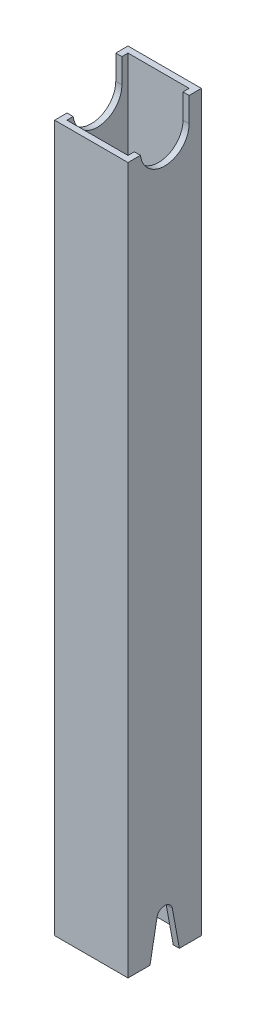
ISO-10303-21;
HEADER;
FILE_DESCRIPTION(('STEP AP214'),'2;1');
FILE_NAME('part.step','',(''),(''),'','','');
FILE_SCHEMA(('AUTOMOTIVE_DESIGN { 1 0 10303 214 1 1 1 1 }'));
ENDSEC;
DATA;
#1=APPLICATION_CONTEXT('core data for automotive mechanical design processes');
#2=APPLICATION_PROTOCOL_DEFINITION('international standard','automotive_design',2000,#1);
#3=PRODUCT_CONTEXT('',#1,'mechanical');
#4=PRODUCT('Part','Part','',(#3));
#5=PRODUCT_RELATED_PRODUCT_CATEGORY('part','',(#4));
#6=PRODUCT_DEFINITION_FORMATION('','',#4);
#7=PRODUCT_DEFINITION_CONTEXT('part definition',#1,'design');
#8=PRODUCT_DEFINITION('design','',#6,#7);
#9=PRODUCT_DEFINITION_SHAPE('','',#8);
#10=(LENGTH_UNIT() NAMED_UNIT(*) SI_UNIT(.MILLI.,.METRE.));
#11=(NAMED_UNIT(*) PLANE_ANGLE_UNIT() SI_UNIT($,.RADIAN.));
#12=(NAMED_UNIT(*) SI_UNIT($,.STERADIAN.) SOLID_ANGLE_UNIT());
#13=UNCERTAINTY_MEASURE_WITH_UNIT(LENGTH_MEASURE(1.E-05),#10,'distance_accuracy_value','');
#14=(GEOMETRIC_REPRESENTATION_CONTEXT(3) GLOBAL_UNCERTAINTY_ASSIGNED_CONTEXT((#13)) GLOBAL_UNIT_ASSIGNED_CONTEXT((#10,
#11,#12)) REPRESENTATION_CONTEXT('',''));
#15=CARTESIAN_POINT('',(0.,0.,0.));
#16=DIRECTION('',(0.,0.,1.));
#17=DIRECTION('',(1.,0.,0.));
#18=AXIS2_PLACEMENT_3D('',#15,#16,#17);
#19=CARTESIAN_POINT('',(0.,0.,0.));
#20=DIRECTION('',(0.,1.,0.));
#21=DIRECTION('',(0.,0.,1.));
#22=AXIS2_PLACEMENT_3D('',#19,#20,#21);
#23=PLANE('',#22);
#24=DIRECTION('',(0.,0.,1.));
#25=VECTOR('',#24,1.);
#26=CARTESIAN_POINT('',(-15.,0.,-15.));
#27=LINE('',#26,#25);
#28=CARTESIAN_POINT('',(-15.,0.,6.));
#29=VERTEX_POINT('',#28);
#30=CARTESIAN_POINT('',(-15.,0.,15.));
#31=VERTEX_POINT('',#30);
#32=EDGE_CURVE('E229',#29,#31,#27,.T.);
#33=ORIENTED_EDGE('',*,*,#32,.F.);
#34=DIRECTION('',(-1.,0.,0.));
#35=VECTOR('',#34,1.);
#36=CARTESIAN_POINT('',(15.,0.,6.));
#37=LINE('',#36,#35);
#38=CARTESIAN_POINT('',(-12.5,0.,6.));
#39=VERTEX_POINT('',#38);
#40=EDGE_CURVE('E199',#39,#29,#37,.T.);
#41=ORIENTED_EDGE('',*,*,#40,.F.);
#42=DIRECTION('',(0.,0.,1.));
#43=VECTOR('',#42,1.);
#44=CARTESIAN_POINT('',(-12.5,0.,-12.5));
#45=LINE('',#44,#43);
#46=CARTESIAN_POINT('',(-12.5,0.,12.5));
#47=VERTEX_POINT('',#46);
#48=EDGE_CURVE('E300',#39,#47,#45,.T.);
#49=ORIENTED_EDGE('',*,*,#48,.T.);
#50=DIRECTION('',(1.,0.,0.));
#51=VECTOR('',#50,1.);
#52=CARTESIAN_POINT('',(-12.5,0.,12.5));
#53=LINE('',#52,#51);
#54=CARTESIAN_POINT('',(12.5,0.,12.5));
#55=VERTEX_POINT('',#54);
#56=EDGE_CURVE('E304',#47,#55,#53,.T.);
#57=ORIENTED_EDGE('',*,*,#56,.T.);
#58=DIRECTION('',(0.,0.,-1.));
#59=VECTOR('',#58,1.);
#60=CARTESIAN_POINT('',(12.5,0.,-12.5));
#61=LINE('',#60,#59);
#62=CARTESIAN_POINT('',(12.5,0.,6.));
#63=VERTEX_POINT('',#62);
#64=EDGE_CURVE('E293',#55,#63,#61,.T.);
#65=ORIENTED_EDGE('',*,*,#64,.T.);
#66=CARTESIAN_POINT('',(15.,0.,6.));
#67=VERTEX_POINT('',#66);
#68=EDGE_CURVE('E384',#67,#63,#37,.T.);
#69=ORIENTED_EDGE('',*,*,#68,.F.);
#70=DIRECTION('',(0.,0.,-1.));
#71=VECTOR('',#70,1.);
#72=CARTESIAN_POINT('',(15.,0.,-15.));
#73=LINE('',#72,#71);
#74=CARTESIAN_POINT('',(15.,0.,15.));
#75=VERTEX_POINT('',#74);
#76=EDGE_CURVE('E217',#75,#67,#73,.T.);
#77=ORIENTED_EDGE('',*,*,#76,.F.);
#78=DIRECTION('',(1.,0.,0.));
#79=VECTOR('',#78,1.);
#80=CARTESIAN_POINT('',(-15.,0.,15.));
#81=LINE('',#80,#79);
#82=EDGE_CURVE('E233',#31,#75,#81,.T.);
#83=ORIENTED_EDGE('',*,*,#82,.F.);
#84=EDGE_LOOP('',(#33,#41,#49,#57,#65,#69,#77,#83));
#85=FACE_BOUND('',#84,.T.);
#86=ADVANCED_FACE('F39',(#85),#23,.F.);
#87=CARTESIAN_POINT('',(-15.,15.,0.));
#88=DIRECTION('',(-1.,0.,0.));
#89=DIRECTION('',(0.,0.,1.));
#90=AXIS2_PLACEMENT_3D('',#87,#88,#89);
#91=CYLINDRICAL_SURFACE('',#90,3.17499999999999);
#92=DIRECTION('',(-1.,0.,0.));
#93=VECTOR('',#92,1.);
#94=CARTESIAN_POINT('',(15.,15.5768234028683,3.12216267383738));
#95=LINE('',#94,#93);
#96=CARTESIAN_POINT('',(-12.5,15.5768234028683,3.12216267383738));
#97=VERTEX_POINT('',#96);
#98=CARTESIAN_POINT('',(-15.,15.5768234028683,3.12216267383738));
#99=VERTEX_POINT('',#98);
#100=EDGE_CURVE('E379',#97,#99,#95,.T.);
#101=ORIENTED_EDGE('',*,*,#100,.T.);
#102=CARTESIAN_POINT('',(-15.,15.,0.));
#103=DIRECTION('',(-1.,0.,0.));
#104=DIRECTION('',(0.,0.,1.));
#105=AXIS2_PLACEMENT_3D('',#102,#103,#104);
#106=CIRCLE('',#105,3.17499999999999);
#107=CARTESIAN_POINT('',(-15.,15.5768234028683,-3.12216267383738));
#108=VERTEX_POINT('',#107);
#109=EDGE_CURVE('E354',#99,#108,#106,.T.);
#110=ORIENTED_EDGE('',*,*,#109,.T.);
#111=DIRECTION('',(-1.,0.,0.));
#112=VECTOR('',#111,1.);
#113=CARTESIAN_POINT('',(15.,15.5768234028683,-3.12216267383738));
#114=LINE('',#113,#112);
#115=CARTESIAN_POINT('',(-12.5,15.5768234028683,-3.12216267383738));
#116=VERTEX_POINT('',#115);
#117=EDGE_CURVE('E389',#116,#108,#114,.T.);
#118=ORIENTED_EDGE('',*,*,#117,.F.);
#119=CARTESIAN_POINT('',(-12.5,15.,0.));
#120=DIRECTION('',(1.,0.,0.));
#121=DIRECTION('',(0.,0.,-1.));
#122=AXIS2_PLACEMENT_3D('',#119,#120,#121);
#123=CIRCLE('',#122,3.17499999999999);
#124=EDGE_CURVE('E251',#116,#97,#123,.T.);
#125=ORIENTED_EDGE('',*,*,#124,.T.);
#126=EDGE_LOOP('',(#101,#110,#118,#125));
#127=FACE_BOUND('',#126,.T.);
#128=ADVANCED_FACE('F416',(#127),#91,.F.);
#129=CARTESIAN_POINT('',(15.,15.5768234028683,3.12216267383738));
#130=VERTEX_POINT('',#129);
#131=CARTESIAN_POINT('',(12.5,15.5768234028683,3.12216267383738));
#132=VERTEX_POINT('',#131);
#133=EDGE_CURVE('E377',#130,#132,#95,.T.);
#134=ORIENTED_EDGE('',*,*,#133,.T.);
#135=CARTESIAN_POINT('',(12.5,15.,0.));
#136=DIRECTION('',(-1.,0.,0.));
#137=DIRECTION('',(0.,0.,1.));
#138=AXIS2_PLACEMENT_3D('',#135,#136,#137);
#139=CIRCLE('',#138,3.17499999999999);
#140=CARTESIAN_POINT('',(12.5,15.5768234028683,-3.12216267383738));
#141=VERTEX_POINT('',#140);
#142=EDGE_CURVE('E255',#132,#141,#139,.T.);
#143=ORIENTED_EDGE('',*,*,#142,.T.);
#144=CARTESIAN_POINT('',(15.,15.5768234028683,-3.12216267383739));
#145=VERTEX_POINT('',#144);
#146=EDGE_CURVE('E376',#145,#141,#114,.T.);
#147=ORIENTED_EDGE('',*,*,#146,.F.);
#148=CARTESIAN_POINT('',(15.,15.,0.));
#149=DIRECTION('',(-1.,0.,0.));
#150=DIRECTION('',(0.,0.,1.));
#151=AXIS2_PLACEMENT_3D('',#148,#149,#150);
#152=CIRCLE('',#151,3.17499999999999);
#153=EDGE_CURVE('E210',#130,#145,#152,.T.);
#154=ORIENTED_EDGE('',*,*,#153,.F.);
#155=EDGE_LOOP('',(#134,#143,#147,#154));
#156=FACE_BOUND('',#155,.T.);
#157=ADVANCED_FACE('F375',(#156),#91,.F.);
#158=CARTESIAN_POINT('',(0.,300.,0.));
#159=DIRECTION('',(0.,1.,0.));
#160=DIRECTION('',(0.,0.,1.));
#161=AXIS2_PLACEMENT_3D('',#158,#159,#160);
#162=PLANE('',#161);
#163=DIRECTION('',(-1.,0.,0.));
#164=VECTOR('',#163,1.);
#165=CARTESIAN_POINT('',(15.,300.,-10.));
#166=LINE('',#165,#164);
#167=CARTESIAN_POINT('',(15.,300.,-10.));
#168=VERTEX_POINT('',#167);
#169=CARTESIAN_POINT('',(12.5,300.,-10.));
#170=VERTEX_POINT('',#169);
#171=EDGE_CURVE('E276',#168,#170,#166,.T.);
#172=ORIENTED_EDGE('',*,*,#171,.F.);
#173=DIRECTION('',(0.,0.,-1.));
#174=VECTOR('',#173,1.);
#175=CARTESIAN_POINT('',(15.,300.,-15.));
#176=LINE('',#175,#174);
#177=CARTESIAN_POINT('',(15.,300.,-15.));
#178=VERTEX_POINT('',#177);
#179=EDGE_CURVE('E236',#168,#178,#176,.T.);
#180=ORIENTED_EDGE('',*,*,#179,.T.);
#181=DIRECTION('',(-1.,0.,0.));
#182=VECTOR('',#181,1.);
#183=CARTESIAN_POINT('',(-15.,300.,-15.));
#184=LINE('',#183,#182);
#185=CARTESIAN_POINT('',(-15.,300.,-15.));
#186=VERTEX_POINT('',#185);
#187=EDGE_CURVE('E311',#178,#186,#184,.T.);
#188=ORIENTED_EDGE('',*,*,#187,.T.);
#189=DIRECTION('',(0.,0.,1.));
#190=VECTOR('',#189,1.);
#191=CARTESIAN_POINT('',(-15.,300.,-15.));
#192=LINE('',#191,#190);
#193=CARTESIAN_POINT('',(-15.,300.,-10.));
#194=VERTEX_POINT('',#193);
#195=EDGE_CURVE('E226',#186,#194,#192,.T.);
#196=ORIENTED_EDGE('',*,*,#195,.T.);
#197=CARTESIAN_POINT('',(-12.5,300.,-10.));
#198=VERTEX_POINT('',#197);
#199=EDGE_CURVE('E262',#198,#194,#166,.T.);
#200=ORIENTED_EDGE('',*,*,#199,.F.);
#201=DIRECTION('',(0.,0.,1.));
#202=VECTOR('',#201,1.);
#203=CARTESIAN_POINT('',(-12.5,300.,-12.5));
#204=LINE('',#203,#202);
#205=CARTESIAN_POINT('',(-12.5,300.,-12.5));
#206=VERTEX_POINT('',#205);
#207=EDGE_CURVE('E274',#206,#198,#204,.T.);
#208=ORIENTED_EDGE('',*,*,#207,.F.);
#209=DIRECTION('',(-1.,0.,0.));
#210=VECTOR('',#209,1.);
#211=CARTESIAN_POINT('',(-12.5,300.,-12.5));
#212=LINE('',#211,#210);
#213=CARTESIAN_POINT('',(12.5,300.,-12.5));
#214=VERTEX_POINT('',#213);
#215=EDGE_CURVE('E284',#214,#206,#212,.T.);
#216=ORIENTED_EDGE('',*,*,#215,.F.);
#217=DIRECTION('',(0.,0.,-1.));
#218=VECTOR('',#217,1.);
#219=CARTESIAN_POINT('',(12.5,300.,-12.5));
#220=LINE('',#219,#218);
#221=EDGE_CURVE('E289',#170,#214,#220,.T.);
#222=ORIENTED_EDGE('',*,*,#221,.F.);
#223=EDGE_LOOP('',(#172,#180,#188,#196,#200,#208,#216,#222));
#224=FACE_BOUND('',#223,.T.);
#225=ADVANCED_FACE('F272',(#224),#162,.T.);
#226=CARTESIAN_POINT('',(15.,0.,-6.));
#227=VERTEX_POINT('',#226);
#228=CARTESIAN_POINT('',(15.,0.,-15.));
#229=VERTEX_POINT('',#228);
#230=EDGE_CURVE('E206',#227,#229,#73,.T.);
#231=ORIENTED_EDGE('',*,*,#230,.F.);
#232=DIRECTION('',(-1.,0.,0.));
#233=VECTOR('',#232,1.);
#234=CARTESIAN_POINT('',(15.,0.,-6.));
#235=LINE('',#234,#233);
#236=CARTESIAN_POINT('',(12.5,0.,-6.));
#237=VERTEX_POINT('',#236);
#238=EDGE_CURVE('E189',#227,#237,#235,.T.);
#239=ORIENTED_EDGE('',*,*,#238,.T.);
#240=CARTESIAN_POINT('',(12.5,0.,-12.5));
#241=VERTEX_POINT('',#240);
#242=EDGE_CURVE('E297',#237,#241,#61,.T.);
#243=ORIENTED_EDGE('',*,*,#242,.T.);
#244=DIRECTION('',(-1.,0.,0.));
#245=VECTOR('',#244,1.);
#246=CARTESIAN_POINT('',(-12.5,0.,-12.5));
#247=LINE('',#246,#245);
#248=CARTESIAN_POINT('',(-12.5,0.,-12.5));
#249=VERTEX_POINT('',#248);
#250=EDGE_CURVE('E296',#241,#249,#247,.T.);
#251=ORIENTED_EDGE('',*,*,#250,.T.);
#252=CARTESIAN_POINT('',(-12.5,0.,-6.));
#253=VERTEX_POINT('',#252);
#254=EDGE_CURVE('E301',#249,#253,#45,.T.);
#255=ORIENTED_EDGE('',*,*,#254,.T.);
#256=CARTESIAN_POINT('',(-15.,0.,-6.));
#257=VERTEX_POINT('',#256);
#258=EDGE_CURVE('E200',#253,#257,#235,.T.);
#259=ORIENTED_EDGE('',*,*,#258,.T.);
#260=CARTESIAN_POINT('',(-15.,0.,-15.));
#261=VERTEX_POINT('',#260);
#262=EDGE_CURVE('E230',#261,#257,#27,.T.);
#263=ORIENTED_EDGE('',*,*,#262,.F.);
#264=DIRECTION('',(-1.,0.,0.));
#265=VECTOR('',#264,1.);
#266=CARTESIAN_POINT('',(-15.,0.,-15.));
#267=LINE('',#266,#265);
#268=EDGE_CURVE('E215',#229,#261,#267,.T.);
#269=ORIENTED_EDGE('',*,*,#268,.F.);
#270=EDGE_LOOP('',(#231,#239,#243,#251,#255,#259,#263,#269));
#271=FACE_BOUND('',#270,.T.);
#272=ADVANCED_FACE('F213',(#271),#23,.F.);
#273=CARTESIAN_POINT('',(15.,300.,-15.));
#274=DIRECTION('',(-1.,0.,0.));
#275=DIRECTION('',(0.,0.,1.));
#276=AXIS2_PLACEMENT_3D('',#273,#274,#275);
#277=PLANE('',#276);
#278=ORIENTED_EDGE('',*,*,#76,.T.);
#279=DIRECTION('',(0.,0.983358322468469,-0.181676662320722));
#280=VECTOR('',#279,1.);
#281=CARTESIAN_POINT('',(15.,0.,6.));
#282=LINE('',#281,#280);
#283=EDGE_CURVE('E211',#67,#130,#282,.T.);
#284=ORIENTED_EDGE('',*,*,#283,.T.);
#285=ORIENTED_EDGE('',*,*,#153,.T.);
#286=DIRECTION('',(0.,-0.983358322468469,-0.181676662320722));
#287=VECTOR('',#286,1.);
#288=CARTESIAN_POINT('',(15.,15.5768234028683,-3.12216267383738));
#289=LINE('',#288,#287);
#290=EDGE_CURVE('E192',#145,#227,#289,.T.);
#291=ORIENTED_EDGE('',*,*,#290,.T.);
#292=ORIENTED_EDGE('',*,*,#230,.T.);
#293=DIRECTION('',(0.,-1.,0.));
#294=VECTOR('',#293,1.);
#295=CARTESIAN_POINT('',(15.,300.,-15.));
#296=LINE('',#295,#294);
#297=EDGE_CURVE('E247',#178,#229,#296,.T.);
#298=ORIENTED_EDGE('',*,*,#297,.F.);
#299=ORIENTED_EDGE('',*,*,#179,.F.);
#300=DIRECTION('',(0.,-1.,0.));
#301=VECTOR('',#300,1.);
#302=CARTESIAN_POINT('',(15.,300.,-10.));
#303=LINE('',#302,#301);
#304=CARTESIAN_POINT('',(15.,290.,-10.));
#305=VERTEX_POINT('',#304);
#306=EDGE_CURVE('E335',#168,#305,#303,.T.);
#307=ORIENTED_EDGE('',*,*,#306,.T.);
#308=CARTESIAN_POINT('',(15.,290.,0.));
#309=DIRECTION('',(-1.,0.,0.));
#310=DIRECTION('',(0.,0.,1.));
#311=AXIS2_PLACEMENT_3D('',#308,#309,#310);
#312=CIRCLE('',#311,10.);
#313=CARTESIAN_POINT('',(15.,288.75,9.92156741649222));
#314=VERTEX_POINT('',#313);
#315=EDGE_CURVE('E393',#305,#314,#312,.T.);
#316=ORIENTED_EDGE('',*,*,#315,.T.);
#317=DIRECTION('',(0.,0.,1.));
#318=VECTOR('',#317,1.);
#319=CARTESIAN_POINT('',(15.,288.75,9.92156741649222));
#320=LINE('',#319,#318);
#321=CARTESIAN_POINT('',(15.,288.75,15.));
#322=VERTEX_POINT('',#321);
#323=EDGE_CURVE('E277',#314,#322,#320,.T.);
#324=ORIENTED_EDGE('',*,*,#323,.T.);
#325=DIRECTION('',(0.,-1.,0.));
#326=VECTOR('',#325,1.);
#327=CARTESIAN_POINT('',(15.,300.,15.));
#328=LINE('',#327,#326);
#329=EDGE_CURVE('E237',#322,#75,#328,.T.);
#330=ORIENTED_EDGE('',*,*,#329,.T.);
#331=EDGE_LOOP('',(#278,#284,#285,#291,#292,#298,#299,#307,#316,#324,#330));
#332=FACE_BOUND('',#331,.T.);
#333=ADVANCED_FACE('F41',(#332),#277,.F.);
#334=CARTESIAN_POINT('',(-15.,300.,-15.));
#335=DIRECTION('',(0.,0.,1.));
#336=DIRECTION('',(1.,0.,0.));
#337=AXIS2_PLACEMENT_3D('',#334,#335,#336);
#338=PLANE('',#337);
#339=ORIENTED_EDGE('',*,*,#268,.T.);
#340=DIRECTION('',(0.,-1.,0.));
#341=VECTOR('',#340,1.);
#342=CARTESIAN_POINT('',(-15.,300.,-15.));
#343=LINE('',#342,#341);
#344=EDGE_CURVE('E244',#186,#261,#343,.T.);
#345=ORIENTED_EDGE('',*,*,#344,.F.);
#346=ORIENTED_EDGE('',*,*,#187,.F.);
#347=ORIENTED_EDGE('',*,*,#297,.T.);
#348=EDGE_LOOP('',(#339,#345,#346,#347));
#349=FACE_BOUND('',#348,.T.);
#350=ADVANCED_FACE('F316',(#349),#338,.F.);
#351=CARTESIAN_POINT('',(-15.,300.,-15.));
#352=DIRECTION('',(1.,0.,0.));
#353=DIRECTION('',(0.,0.,-1.));
#354=AXIS2_PLACEMENT_3D('',#351,#352,#353);
#355=PLANE('',#354);
#356=ORIENTED_EDGE('',*,*,#109,.F.);
#357=DIRECTION('',(0.,0.983358322468469,-0.181676662320722));
#358=VECTOR('',#357,1.);
#359=CARTESIAN_POINT('',(-15.,0.,6.));
#360=LINE('',#359,#358);
#361=EDGE_CURVE('E56',#29,#99,#360,.T.);
#362=ORIENTED_EDGE('',*,*,#361,.F.);
#363=ORIENTED_EDGE('',*,*,#32,.T.);
#364=DIRECTION('',(0.,-1.,0.));
#365=VECTOR('',#364,1.);
#366=CARTESIAN_POINT('',(-15.,300.,15.));
#367=LINE('',#366,#365);
#368=CARTESIAN_POINT('',(-15.,288.75,15.));
#369=VERTEX_POINT('',#368);
#370=EDGE_CURVE('E240',#369,#31,#367,.T.);
#371=ORIENTED_EDGE('',*,*,#370,.F.);
#372=DIRECTION('',(0.,0.,1.));
#373=VECTOR('',#372,1.);
#374=CARTESIAN_POINT('',(-15.,288.75,9.92156741649222));
#375=LINE('',#374,#373);
#376=CARTESIAN_POINT('',(-15.,288.75,9.92156741649222));
#377=VERTEX_POINT('',#376);
#378=EDGE_CURVE('E327',#377,#369,#375,.T.);
#379=ORIENTED_EDGE('',*,*,#378,.F.);
#380=CARTESIAN_POINT('',(-15.,290.,0.));
#381=DIRECTION('',(-1.,0.,0.));
#382=DIRECTION('',(0.,0.,1.));
#383=AXIS2_PLACEMENT_3D('',#380,#381,#382);
#384=CIRCLE('',#383,10.);
#385=CARTESIAN_POINT('',(-15.,290.,-10.));
#386=VERTEX_POINT('',#385);
#387=EDGE_CURVE('E324',#386,#377,#384,.T.);
#388=ORIENTED_EDGE('',*,*,#387,.F.);
#389=DIRECTION('',(0.,-1.,0.));
#390=VECTOR('',#389,1.);
#391=CARTESIAN_POINT('',(-15.,300.,-10.));
#392=LINE('',#391,#390);
#393=EDGE_CURVE('E321',#194,#386,#392,.T.);
#394=ORIENTED_EDGE('',*,*,#393,.F.);
#395=ORIENTED_EDGE('',*,*,#195,.F.);
#396=ORIENTED_EDGE('',*,*,#344,.T.);
#397=ORIENTED_EDGE('',*,*,#262,.T.);
#398=DIRECTION('',(0.,-0.983358322468469,-0.181676662320722));
#399=VECTOR('',#398,1.);
#400=CARTESIAN_POINT('',(-15.,15.5768234028683,-3.12216267383738));
#401=LINE('',#400,#399);
#402=EDGE_CURVE('E410',#108,#257,#401,.T.);
#403=ORIENTED_EDGE('',*,*,#402,.F.);
#404=EDGE_LOOP('',(#356,#362,#363,#371,#379,#388,#394,#395,#396,#397,#403));
#405=FACE_BOUND('',#404,.T.);
#406=ADVANCED_FACE('F319',(#405),#355,.F.);
#407=CARTESIAN_POINT('',(-15.,300.,15.));
#408=DIRECTION('',(0.,0.,-1.));
#409=DIRECTION('',(-1.,0.,0.));
#410=AXIS2_PLACEMENT_3D('',#407,#408,#409);
#411=PLANE('',#410);
#412=ORIENTED_EDGE('',*,*,#329,.F.);
#413=DIRECTION('',(-1.,0.,0.));
#414=VECTOR('',#413,1.);
#415=CARTESIAN_POINT('',(15.,288.75,15.));
#416=LINE('',#415,#414);
#417=EDGE_CURVE('E336',#322,#369,#416,.T.);
#418=ORIENTED_EDGE('',*,*,#417,.T.);
#419=ORIENTED_EDGE('',*,*,#370,.T.);
#420=ORIENTED_EDGE('',*,*,#82,.T.);
#421=EDGE_LOOP('',(#412,#418,#419,#420));
#422=FACE_BOUND('',#421,.T.);
#423=ADVANCED_FACE('F401',(#422),#411,.F.);
#424=CARTESIAN_POINT('',(12.5,300.,-12.5));
#425=DIRECTION('',(-1.,0.,0.));
#426=DIRECTION('',(0.,0.,1.));
#427=AXIS2_PLACEMENT_3D('',#424,#425,#426);
#428=PLANE('',#427);
#429=DIRECTION('',(0.,0.983358322468469,-0.181676662320722));
#430=VECTOR('',#429,1.);
#431=CARTESIAN_POINT('',(12.5,293.403162381391,-48.2065959456047));
#432=LINE('',#431,#430);
#433=EDGE_CURVE('E325',#63,#132,#432,.T.);
#434=ORIENTED_EDGE('',*,*,#433,.F.);
#435=ORIENTED_EDGE('',*,*,#64,.F.);
#436=DIRECTION('',(0.,-1.,0.));
#437=VECTOR('',#436,1.);
#438=CARTESIAN_POINT('',(12.5,300.,12.5));
#439=LINE('',#438,#437);
#440=CARTESIAN_POINT('',(12.5,288.75,12.5));
#441=VERTEX_POINT('',#440);
#442=EDGE_CURVE('E283',#441,#55,#439,.T.);
#443=ORIENTED_EDGE('',*,*,#442,.F.);
#444=DIRECTION('',(0.,0.,1.));
#445=VECTOR('',#444,1.);
#446=CARTESIAN_POINT('',(12.5,288.75,-12.4999999999999));
#447=LINE('',#446,#445);
#448=CARTESIAN_POINT('',(12.5,288.75,9.92156741649222));
#449=VERTEX_POINT('',#448);
#450=EDGE_CURVE('E348',#449,#441,#447,.T.);
#451=ORIENTED_EDGE('',*,*,#450,.F.);
#452=CARTESIAN_POINT('',(12.5,290.,0.));
#453=DIRECTION('',(-1.,0.,0.));
#454=DIRECTION('',(0.,0.,1.));
#455=AXIS2_PLACEMENT_3D('',#452,#453,#454);
#456=CIRCLE('',#455,10.);
#457=CARTESIAN_POINT('',(12.5,290.,-10.));
#458=VERTEX_POINT('',#457);
#459=EDGE_CURVE('E352',#458,#449,#456,.T.);
#460=ORIENTED_EDGE('',*,*,#459,.F.);
#461=DIRECTION('',(0.,-1.,0.));
#462=VECTOR('',#461,1.);
#463=CARTESIAN_POINT('',(12.5,300.,-10.));
#464=LINE('',#463,#462);
#465=EDGE_CURVE('E350',#170,#458,#464,.T.);
#466=ORIENTED_EDGE('',*,*,#465,.F.);
#467=ORIENTED_EDGE('',*,*,#221,.T.);
#468=DIRECTION('',(0.,-1.,0.));
#469=VECTOR('',#468,1.);
#470=CARTESIAN_POINT('',(12.5,300.,-12.5));
#471=LINE('',#470,#469);
#472=EDGE_CURVE('E218',#214,#241,#471,.T.);
#473=ORIENTED_EDGE('',*,*,#472,.T.);
#474=ORIENTED_EDGE('',*,*,#242,.F.);
#475=DIRECTION('',(0.,-0.983358322468469,-0.181676662320722));
#476=VECTOR('',#475,1.);
#477=CARTESIAN_POINT('',(12.5,288.936830934107,47.3814357048047));
#478=LINE('',#477,#476);
#479=EDGE_CURVE('E195',#141,#237,#478,.T.);
#480=ORIENTED_EDGE('',*,*,#479,.F.);
#481=ORIENTED_EDGE('',*,*,#142,.F.);
#482=EDGE_LOOP('',(#434,#435,#443,#451,#460,#466,#467,#473,#474,#480,#481));
#483=FACE_BOUND('',#482,.T.);
#484=ADVANCED_FACE('F365',(#483),#428,.T.);
#485=CARTESIAN_POINT('',(-12.5,300.,-12.5));
#486=DIRECTION('',(0.,0.,1.));
#487=DIRECTION('',(1.,0.,0.));
#488=AXIS2_PLACEMENT_3D('',#485,#486,#487);
#489=PLANE('',#488);
#490=ORIENTED_EDGE('',*,*,#250,.F.);
#491=ORIENTED_EDGE('',*,*,#472,.F.);
#492=ORIENTED_EDGE('',*,*,#215,.T.);
#493=DIRECTION('',(0.,-1.,0.));
#494=VECTOR('',#493,1.);
#495=CARTESIAN_POINT('',(-12.5,300.,-12.5));
#496=LINE('',#495,#494);
#497=EDGE_CURVE('E222',#206,#249,#496,.T.);
#498=ORIENTED_EDGE('',*,*,#497,.T.);
#499=EDGE_LOOP('',(#490,#491,#492,#498));
#500=FACE_BOUND('',#499,.T.);
#501=ADVANCED_FACE('F369',(#500),#489,.T.);
#502=CARTESIAN_POINT('',(-12.5,300.,-12.5));
#503=DIRECTION('',(1.,0.,0.));
#504=DIRECTION('',(0.,0.,-1.));
#505=AXIS2_PLACEMENT_3D('',#502,#503,#504);
#506=PLANE('',#505);
#507=DIRECTION('',(0.,-0.983358322468469,0.181676662320722));
#508=VECTOR('',#507,1.);
#509=CARTESIAN_POINT('',(-12.5,293.403162381391,-48.2065959456047));
#510=LINE('',#509,#508);
#511=EDGE_CURVE('E329',#97,#39,#510,.T.);
#512=ORIENTED_EDGE('',*,*,#511,.F.);
#513=ORIENTED_EDGE('',*,*,#124,.F.);
#514=DIRECTION('',(0.,0.983358322468469,0.181676662320722));
#515=VECTOR('',#514,1.);
#516=CARTESIAN_POINT('',(-12.5,288.936830934107,47.3814357048047));
#517=LINE('',#516,#515);
#518=EDGE_CURVE('E65',#253,#116,#517,.T.);
#519=ORIENTED_EDGE('',*,*,#518,.F.);
#520=ORIENTED_EDGE('',*,*,#254,.F.);
#521=ORIENTED_EDGE('',*,*,#497,.F.);
#522=ORIENTED_EDGE('',*,*,#207,.T.);
#523=DIRECTION('',(0.,1.,0.));
#524=VECTOR('',#523,1.);
#525=CARTESIAN_POINT('',(-12.5,300.,-10.));
#526=LINE('',#525,#524);
#527=CARTESIAN_POINT('',(-12.5,290.,-10.));
#528=VERTEX_POINT('',#527);
#529=EDGE_CURVE('E47',#528,#198,#526,.T.);
#530=ORIENTED_EDGE('',*,*,#529,.F.);
#531=CARTESIAN_POINT('',(-12.5,290.,0.));
#532=DIRECTION('',(1.,0.,0.));
#533=DIRECTION('',(0.,0.,-1.));
#534=AXIS2_PLACEMENT_3D('',#531,#532,#533);
#535=CIRCLE('',#534,10.);
#536=CARTESIAN_POINT('',(-12.5,288.75,9.92156741649222));
#537=VERTEX_POINT('',#536);
#538=EDGE_CURVE('E11',#537,#528,#535,.T.);
#539=ORIENTED_EDGE('',*,*,#538,.F.);
#540=DIRECTION('',(0.,0.,-1.));
#541=VECTOR('',#540,1.);
#542=CARTESIAN_POINT('',(-12.5,288.75,-12.4999999999999));
#543=LINE('',#542,#541);
#544=CARTESIAN_POINT('',(-12.5,288.75,12.5));
#545=VERTEX_POINT('',#544);
#546=EDGE_CURVE('E339',#545,#537,#543,.T.);
#547=ORIENTED_EDGE('',*,*,#546,.F.);
#548=DIRECTION('',(0.,-1.,0.));
#549=VECTOR('',#548,1.);
#550=CARTESIAN_POINT('',(-12.5,300.,12.5));
#551=LINE('',#550,#549);
#552=EDGE_CURVE('E287',#545,#47,#551,.T.);
#553=ORIENTED_EDGE('',*,*,#552,.T.);
#554=ORIENTED_EDGE('',*,*,#48,.F.);
#555=EDGE_LOOP('',(#512,#513,#519,#520,#521,#522,#530,#539,#547,#553,#554));
#556=FACE_BOUND('',#555,.T.);
#557=ADVANCED_FACE('F281',(#556),#506,.T.);
#558=CARTESIAN_POINT('',(-12.5,300.,12.5));
#559=DIRECTION('',(0.,0.,-1.));
#560=DIRECTION('',(-1.,0.,0.));
#561=AXIS2_PLACEMENT_3D('',#558,#559,#560);
#562=PLANE('',#561);
#563=DIRECTION('',(-1.,0.,0.));
#564=VECTOR('',#563,1.);
#565=CARTESIAN_POINT('',(-12.5,288.75,12.5));
#566=LINE('',#565,#564);
#567=EDGE_CURVE('E250',#441,#545,#566,.T.);
#568=ORIENTED_EDGE('',*,*,#567,.F.);
#569=ORIENTED_EDGE('',*,*,#442,.T.);
#570=ORIENTED_EDGE('',*,*,#56,.F.);
#571=ORIENTED_EDGE('',*,*,#552,.F.);
#572=EDGE_LOOP('',(#568,#569,#570,#571));
#573=FACE_BOUND('',#572,.T.);
#574=ADVANCED_FACE('F430',(#573),#562,.T.);
#575=CARTESIAN_POINT('',(15.,290.,0.));
#576=DIRECTION('',(-1.,0.,0.));
#577=DIRECTION('',(0.,0.,1.));
#578=AXIS2_PLACEMENT_3D('',#575,#576,#577);
#579=CYLINDRICAL_SURFACE('',#578,10.);
#580=ORIENTED_EDGE('',*,*,#459,.T.);
#581=DIRECTION('',(-1.,0.,0.));
#582=VECTOR('',#581,1.);
#583=CARTESIAN_POINT('',(15.,288.75,9.92156741649222));
#584=LINE('',#583,#582);
#585=EDGE_CURVE('E340',#314,#449,#584,.T.);
#586=ORIENTED_EDGE('',*,*,#585,.F.);
#587=ORIENTED_EDGE('',*,*,#315,.F.);
#588=DIRECTION('',(-1.,0.,0.));
#589=VECTOR('',#588,1.);
#590=CARTESIAN_POINT('',(15.,290.,-10.));
#591=LINE('',#590,#589);
#592=EDGE_CURVE('E344',#305,#458,#591,.T.);
#593=ORIENTED_EDGE('',*,*,#592,.T.);
#594=EDGE_LOOP('',(#580,#586,#587,#593));
#595=FACE_BOUND('',#594,.T.);
#596=ADVANCED_FACE('F469',(#595),#579,.F.);
#597=CARTESIAN_POINT('',(15.,300.,-10.));
#598=DIRECTION('',(0.,0.,-1.));
#599=DIRECTION('',(0.,1.,0.));
#600=AXIS2_PLACEMENT_3D('',#597,#598,#599);
#601=PLANE('',#600);
#602=ORIENTED_EDGE('',*,*,#465,.T.);
#603=ORIENTED_EDGE('',*,*,#592,.F.);
#604=ORIENTED_EDGE('',*,*,#306,.F.);
#605=ORIENTED_EDGE('',*,*,#171,.T.);
#606=EDGE_LOOP('',(#602,#603,#604,#605));
#607=FACE_BOUND('',#606,.T.);
#608=ADVANCED_FACE('F473',(#607),#601,.F.);
#609=CARTESIAN_POINT('',(15.,288.75,9.92156741649222));
#610=DIRECTION('',(0.,-1.,0.));
#611=DIRECTION('',(0.,0.,-1.));
#612=AXIS2_PLACEMENT_3D('',#609,#610,#611);
#613=PLANE('',#612);
#614=ORIENTED_EDGE('',*,*,#450,.T.);
#615=ORIENTED_EDGE('',*,*,#567,.T.);
#616=ORIENTED_EDGE('',*,*,#546,.T.);
#617=EDGE_CURVE('E343',#537,#377,#584,.T.);
#618=ORIENTED_EDGE('',*,*,#617,.T.);
#619=ORIENTED_EDGE('',*,*,#378,.T.);
#620=ORIENTED_EDGE('',*,*,#417,.F.);
#621=ORIENTED_EDGE('',*,*,#323,.F.);
#622=ORIENTED_EDGE('',*,*,#585,.T.);
#623=EDGE_LOOP('',(#614,#615,#616,#618,#619,#620,#621,#622));
#624=FACE_BOUND('',#623,.T.);
#625=ADVANCED_FACE('F424',(#624),#613,.F.);
#626=ORIENTED_EDGE('',*,*,#538,.T.);
#627=EDGE_CURVE('E264',#528,#386,#591,.T.);
#628=ORIENTED_EDGE('',*,*,#627,.T.);
#629=ORIENTED_EDGE('',*,*,#387,.T.);
#630=ORIENTED_EDGE('',*,*,#617,.F.);
#631=EDGE_LOOP('',(#626,#628,#629,#630));
#632=FACE_BOUND('',#631,.T.);
#633=ADVANCED_FACE('F427',(#632),#579,.F.);
#634=ORIENTED_EDGE('',*,*,#529,.T.);
#635=ORIENTED_EDGE('',*,*,#199,.T.);
#636=ORIENTED_EDGE('',*,*,#393,.T.);
#637=ORIENTED_EDGE('',*,*,#627,.F.);
#638=EDGE_LOOP('',(#634,#635,#636,#637));
#639=FACE_BOUND('',#638,.T.);
#640=ADVANCED_FACE('F260',(#639),#601,.F.);
#641=CARTESIAN_POINT('',(15.,15.5768234028683,-3.12216267383738));
#642=DIRECTION('',(0.,0.181676662320722,-0.983358322468469));
#643=DIRECTION('',(0.,0.983358322468469,0.181676662320722));
#644=AXIS2_PLACEMENT_3D('',#641,#642,#643);
#645=PLANE('',#644);
#646=ORIENTED_EDGE('',*,*,#479,.T.);
#647=ORIENTED_EDGE('',*,*,#238,.F.);
#648=ORIENTED_EDGE('',*,*,#290,.F.);
#649=ORIENTED_EDGE('',*,*,#146,.T.);
#650=EDGE_LOOP('',(#646,#647,#648,#649));
#651=FACE_BOUND('',#650,.T.);
#652=ADVANCED_FACE('F191',(#651),#645,.F.);
#653=CARTESIAN_POINT('',(15.,0.,6.));
#654=DIRECTION('',(0.,0.181676662320722,0.983358322468469));
#655=DIRECTION('',(0.,-0.983358322468469,0.181676662320722));
#656=AXIS2_PLACEMENT_3D('',#653,#654,#655);
#657=PLANE('',#656);
#658=ORIENTED_EDGE('',*,*,#433,.T.);
#659=ORIENTED_EDGE('',*,*,#133,.F.);
#660=ORIENTED_EDGE('',*,*,#283,.F.);
#661=ORIENTED_EDGE('',*,*,#68,.T.);
#662=EDGE_LOOP('',(#658,#659,#660,#661));
#663=FACE_BOUND('',#662,.T.);
#664=ADVANCED_FACE('F434',(#663),#657,.F.);
#665=ORIENTED_EDGE('',*,*,#518,.T.);
#666=ORIENTED_EDGE('',*,*,#117,.T.);
#667=ORIENTED_EDGE('',*,*,#402,.T.);
#668=ORIENTED_EDGE('',*,*,#258,.F.);
#669=EDGE_LOOP('',(#665,#666,#667,#668));
#670=FACE_BOUND('',#669,.T.);
#671=ADVANCED_FACE('F414',(#670),#645,.F.);
#672=ORIENTED_EDGE('',*,*,#511,.T.);
#673=ORIENTED_EDGE('',*,*,#40,.T.);
#674=ORIENTED_EDGE('',*,*,#361,.T.);
#675=ORIENTED_EDGE('',*,*,#100,.F.);
#676=EDGE_LOOP('',(#672,#673,#674,#675));
#677=FACE_BOUND('',#676,.T.);
#678=ADVANCED_FACE('F418',(#677),#657,.F.);
#679=CLOSED_SHELL('',(#86,#128,#157,#225,#272,#333,#350,#406,#423,#484,#501,#557,#574,#596,#608,
#625,#633,#640,#652,#664,#671,#678));
#680=MANIFOLD_SOLID_BREP('B2',#679);
#681=ADVANCED_BREP_SHAPE_REPRESENTATION('',(#18,#680),#14);
#682=SHAPE_DEFINITION_REPRESENTATION(#9,#681);
ENDSEC;
END-ISO-10303-21;
